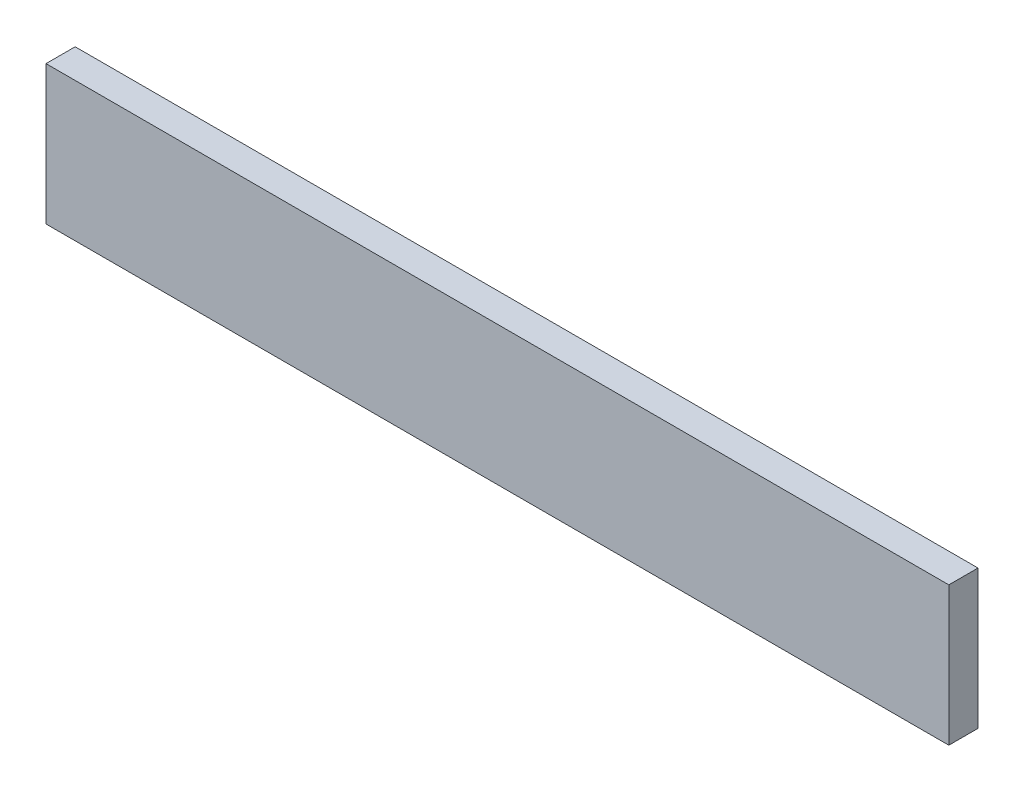
ISO-10303-21;
HEADER;
FILE_DESCRIPTION(('STEP AP214'),'2;1');
FILE_NAME('part.step','',(''),(''),'','','');
FILE_SCHEMA(('AUTOMOTIVE_DESIGN { 1 0 10303 214 1 1 1 1 }'));
ENDSEC;
DATA;
#1=APPLICATION_CONTEXT('core data for automotive mechanical design processes');
#2=APPLICATION_PROTOCOL_DEFINITION('international standard','automotive_design',2000,#1);
#3=PRODUCT_CONTEXT('',#1,'mechanical');
#4=PRODUCT('Part','Part','',(#3));
#5=PRODUCT_RELATED_PRODUCT_CATEGORY('part','',(#4));
#6=PRODUCT_DEFINITION_FORMATION('','',#4);
#7=PRODUCT_DEFINITION_CONTEXT('part definition',#1,'design');
#8=PRODUCT_DEFINITION('design','',#6,#7);
#9=PRODUCT_DEFINITION_SHAPE('','',#8);
#10=(LENGTH_UNIT() NAMED_UNIT(*) SI_UNIT(.MILLI.,.METRE.));
#11=(NAMED_UNIT(*) PLANE_ANGLE_UNIT() SI_UNIT($,.RADIAN.));
#12=(NAMED_UNIT(*) SI_UNIT($,.STERADIAN.) SOLID_ANGLE_UNIT());
#13=UNCERTAINTY_MEASURE_WITH_UNIT(LENGTH_MEASURE(1.E-05),#10,'distance_accuracy_value','');
#14=(GEOMETRIC_REPRESENTATION_CONTEXT(3) GLOBAL_UNCERTAINTY_ASSIGNED_CONTEXT((#13)) GLOBAL_UNIT_ASSIGNED_CONTEXT((#10,
#11,#12)) REPRESENTATION_CONTEXT('',''));
#15=CARTESIAN_POINT('',(0.,0.,0.));
#16=DIRECTION('',(0.,0.,1.));
#17=DIRECTION('',(1.,0.,0.));
#18=AXIS2_PLACEMENT_3D('',#15,#16,#17);
#19=CARTESIAN_POINT('',(0.,0.,2.667));
#20=DIRECTION('',(1.,0.,0.));
#21=DIRECTION('',(0.,0.,-1.));
#22=AXIS2_PLACEMENT_3D('',#19,#20,#21);
#23=PLANE('',#22);
#24=DIRECTION('',(0.,-1.,0.));
#25=VECTOR('',#24,1.);
#26=CARTESIAN_POINT('',(0.,0.,-2.667));
#27=LINE('',#26,#25);
#28=CARTESIAN_POINT('',(0.,25.4,-2.667));
#29=VERTEX_POINT('',#28);
#30=CARTESIAN_POINT('',(0.,0.,-2.667));
#31=VERTEX_POINT('',#30);
#32=EDGE_CURVE('E98',#29,#31,#27,.T.);
#33=ORIENTED_EDGE('',*,*,#32,.T.);
#34=DIRECTION('',(0.,0.,-1.));
#35=VECTOR('',#34,1.);
#36=CARTESIAN_POINT('',(0.,0.,2.667));
#37=LINE('',#36,#35);
#38=CARTESIAN_POINT('',(0.,0.,2.667));
#39=VERTEX_POINT('',#38);
#40=EDGE_CURVE('E11',#39,#31,#37,.T.);
#41=ORIENTED_EDGE('',*,*,#40,.F.);
#42=DIRECTION('',(0.,-1.,0.));
#43=VECTOR('',#42,1.);
#44=CARTESIAN_POINT('',(0.,0.,2.667));
#45=LINE('',#44,#43);
#46=CARTESIAN_POINT('',(0.,25.4,2.667));
#47=VERTEX_POINT('',#46);
#48=EDGE_CURVE('E86',#47,#39,#45,.T.);
#49=ORIENTED_EDGE('',*,*,#48,.F.);
#50=DIRECTION('',(0.,0.,-1.));
#51=VECTOR('',#50,1.);
#52=CARTESIAN_POINT('',(0.,25.4,2.667));
#53=LINE('',#52,#51);
#54=EDGE_CURVE('E94',#47,#29,#53,.T.);
#55=ORIENTED_EDGE('',*,*,#54,.T.);
#56=EDGE_LOOP('',(#33,#41,#49,#55));
#57=FACE_BOUND('',#56,.T.);
#58=ADVANCED_FACE('F35',(#57),#23,.F.);
#59=CARTESIAN_POINT('',(0.,0.,2.667));
#60=DIRECTION('',(0.,1.,0.));
#61=DIRECTION('',(0.,0.,1.));
#62=AXIS2_PLACEMENT_3D('',#59,#60,#61);
#63=PLANE('',#62);
#64=DIRECTION('',(1.,0.,0.));
#65=VECTOR('',#64,1.);
#66=CARTESIAN_POINT('',(0.,0.,-2.667));
#67=LINE('',#66,#65);
#68=CARTESIAN_POINT('',(165.1,0.,-2.667));
#69=VERTEX_POINT('',#68);
#70=EDGE_CURVE('E90',#31,#69,#67,.T.);
#71=ORIENTED_EDGE('',*,*,#70,.T.);
#72=DIRECTION('',(0.,0.,-1.));
#73=VECTOR('',#72,1.);
#74=CARTESIAN_POINT('',(165.1,0.,2.667));
#75=LINE('',#74,#73);
#76=CARTESIAN_POINT('',(165.1,0.,2.667));
#77=VERTEX_POINT('',#76);
#78=EDGE_CURVE('E43',#77,#69,#75,.T.);
#79=ORIENTED_EDGE('',*,*,#78,.F.);
#80=DIRECTION('',(1.,0.,0.));
#81=VECTOR('',#80,1.);
#82=CARTESIAN_POINT('',(0.,0.,2.667));
#83=LINE('',#82,#81);
#84=EDGE_CURVE('E81',#39,#77,#83,.T.);
#85=ORIENTED_EDGE('',*,*,#84,.F.);
#86=ORIENTED_EDGE('',*,*,#40,.T.);
#87=EDGE_LOOP('',(#71,#79,#85,#86));
#88=FACE_BOUND('',#87,.T.);
#89=ADVANCED_FACE('F89',(#88),#63,.F.);
#90=CARTESIAN_POINT('',(165.1,0.,2.667));
#91=DIRECTION('',(-1.,0.,0.));
#92=DIRECTION('',(0.,0.,1.));
#93=AXIS2_PLACEMENT_3D('',#90,#91,#92);
#94=PLANE('',#93);
#95=DIRECTION('',(0.,1.,0.));
#96=VECTOR('',#95,1.);
#97=CARTESIAN_POINT('',(165.1,0.,-2.667));
#98=LINE('',#97,#96);
#99=CARTESIAN_POINT('',(165.1,25.4,-2.667));
#100=VERTEX_POINT('',#99);
#101=EDGE_CURVE('E68',#69,#100,#98,.T.);
#102=ORIENTED_EDGE('',*,*,#101,.T.);
#103=DIRECTION('',(0.,0.,-1.));
#104=VECTOR('',#103,1.);
#105=CARTESIAN_POINT('',(165.1,25.4,2.667));
#106=LINE('',#105,#104);
#107=CARTESIAN_POINT('',(165.1,25.4,2.667));
#108=VERTEX_POINT('',#107);
#109=EDGE_CURVE('E91',#108,#100,#106,.T.);
#110=ORIENTED_EDGE('',*,*,#109,.F.);
#111=DIRECTION('',(0.,1.,0.));
#112=VECTOR('',#111,1.);
#113=CARTESIAN_POINT('',(165.1,0.,2.667));
#114=LINE('',#113,#112);
#115=EDGE_CURVE('E84',#77,#108,#114,.T.);
#116=ORIENTED_EDGE('',*,*,#115,.F.);
#117=ORIENTED_EDGE('',*,*,#78,.T.);
#118=EDGE_LOOP('',(#102,#110,#116,#117));
#119=FACE_BOUND('',#118,.T.);
#120=ADVANCED_FACE('F92',(#119),#94,.F.);
#121=CARTESIAN_POINT('',(0.,25.4,2.667));
#122=DIRECTION('',(0.,-1.,0.));
#123=DIRECTION('',(0.,0.,-1.));
#124=AXIS2_PLACEMENT_3D('',#121,#122,#123);
#125=PLANE('',#124);
#126=DIRECTION('',(-1.,0.,0.));
#127=VECTOR('',#126,1.);
#128=CARTESIAN_POINT('',(0.,25.4,-2.667));
#129=LINE('',#128,#127);
#130=EDGE_CURVE('E74',#100,#29,#129,.T.);
#131=ORIENTED_EDGE('',*,*,#130,.T.);
#132=ORIENTED_EDGE('',*,*,#54,.F.);
#133=DIRECTION('',(-1.,0.,0.));
#134=VECTOR('',#133,1.);
#135=CARTESIAN_POINT('',(0.,25.4,2.667));
#136=LINE('',#135,#134);
#137=EDGE_CURVE('E51',#108,#47,#136,.T.);
#138=ORIENTED_EDGE('',*,*,#137,.F.);
#139=ORIENTED_EDGE('',*,*,#109,.T.);
#140=EDGE_LOOP('',(#131,#132,#138,#139));
#141=FACE_BOUND('',#140,.T.);
#142=ADVANCED_FACE('F105',(#141),#125,.F.);
#143=CARTESIAN_POINT('',(0.,25.4,2.667));
#144=DIRECTION('',(0.,0.,-1.));
#145=DIRECTION('',(-1.,0.,0.));
#146=AXIS2_PLACEMENT_3D('',#143,#144,#145);
#147=PLANE('',#146);
#148=ORIENTED_EDGE('',*,*,#48,.T.);
#149=ORIENTED_EDGE('',*,*,#84,.T.);
#150=ORIENTED_EDGE('',*,*,#115,.T.);
#151=ORIENTED_EDGE('',*,*,#137,.T.);
#152=EDGE_LOOP('',(#148,#149,#150,#151));
#153=FACE_BOUND('',#152,.T.);
#154=ADVANCED_FACE('F82',(#153),#147,.F.);
#155=CARTESIAN_POINT('',(0.,25.4,-2.667));
#156=DIRECTION('',(0.,0.,-1.));
#157=DIRECTION('',(-1.,0.,0.));
#158=AXIS2_PLACEMENT_3D('',#155,#156,#157);
#159=PLANE('',#158);
#160=ORIENTED_EDGE('',*,*,#32,.F.);
#161=ORIENTED_EDGE('',*,*,#130,.F.);
#162=ORIENTED_EDGE('',*,*,#101,.F.);
#163=ORIENTED_EDGE('',*,*,#70,.F.);
#164=EDGE_LOOP('',(#160,#161,#162,#163));
#165=FACE_BOUND('',#164,.T.);
#166=ADVANCED_FACE('F108',(#165),#159,.T.);
#167=CLOSED_SHELL('',(#58,#89,#120,#142,#154,#166));
#168=MANIFOLD_SOLID_BREP('B2',#167);
#169=ADVANCED_BREP_SHAPE_REPRESENTATION('',(#18,#168),#14);
#170=SHAPE_DEFINITION_REPRESENTATION(#9,#169);
ENDSEC;
END-ISO-10303-21;
